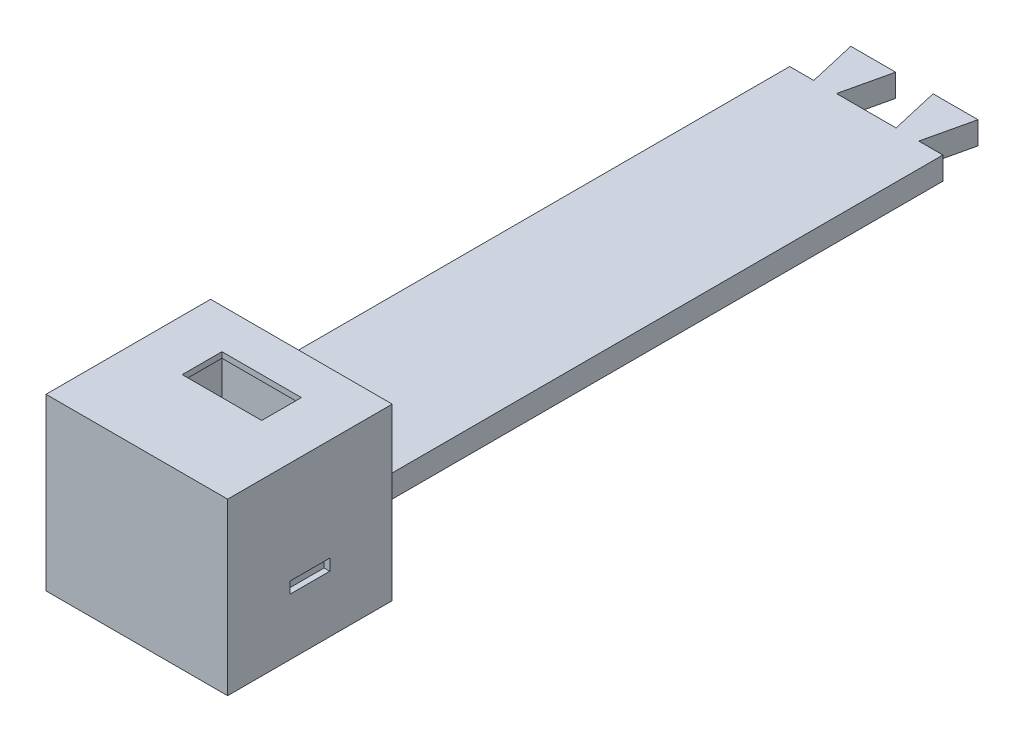
ISO-10303-21;
HEADER;
FILE_DESCRIPTION(('STEP AP214'),'2;1');
FILE_NAME('part.step','',(''),(''),'','','');
FILE_SCHEMA(('AUTOMOTIVE_DESIGN { 1 0 10303 214 1 1 1 1 }'));
ENDSEC;
DATA;
#1=APPLICATION_CONTEXT('core data for automotive mechanical design processes');
#2=APPLICATION_PROTOCOL_DEFINITION('international standard','automotive_design',2000,#1);
#3=PRODUCT_CONTEXT('',#1,'mechanical');
#4=PRODUCT('Part','Part','',(#3));
#5=PRODUCT_RELATED_PRODUCT_CATEGORY('part','',(#4));
#6=PRODUCT_DEFINITION_FORMATION('','',#4);
#7=PRODUCT_DEFINITION_CONTEXT('part definition',#1,'design');
#8=PRODUCT_DEFINITION('design','',#6,#7);
#9=PRODUCT_DEFINITION_SHAPE('','',#8);
#10=(LENGTH_UNIT() NAMED_UNIT(*) SI_UNIT(.MILLI.,.METRE.));
#11=(NAMED_UNIT(*) PLANE_ANGLE_UNIT() SI_UNIT($,.RADIAN.));
#12=(NAMED_UNIT(*) SI_UNIT($,.STERADIAN.) SOLID_ANGLE_UNIT());
#13=UNCERTAINTY_MEASURE_WITH_UNIT(LENGTH_MEASURE(1.E-05),#10,'distance_accuracy_value','');
#14=(GEOMETRIC_REPRESENTATION_CONTEXT(3) GLOBAL_UNCERTAINTY_ASSIGNED_CONTEXT((#13)) GLOBAL_UNIT_ASSIGNED_CONTEXT((#10,
#11,#12)) REPRESENTATION_CONTEXT('',''));
#15=CARTESIAN_POINT('',(0.,0.,0.));
#16=DIRECTION('',(0.,0.,1.));
#17=DIRECTION('',(1.,0.,0.));
#18=AXIS2_PLACEMENT_3D('',#15,#16,#17);
#19=CARTESIAN_POINT('',(0.,0.,0.));
#20=DIRECTION('',(0.,0.,-1.));
#21=DIRECTION('',(-1.,0.,0.));
#22=AXIS2_PLACEMENT_3D('',#19,#20,#21);
#23=PLANE('',#22);
#24=DIRECTION('',(0.,1.,0.));
#25=VECTOR('',#24,1.);
#26=CARTESIAN_POINT('',(3.2929258272084,-2.,0.));
#27=LINE('',#26,#25);
#28=CARTESIAN_POINT('',(3.2929258272084,-2.,0.));
#29=VERTEX_POINT('',#28);
#30=CARTESIAN_POINT('',(3.2929258272084,2.,0.));
#31=VERTEX_POINT('',#30);
#32=EDGE_CURVE('E415',#29,#31,#27,.T.);
#33=ORIENTED_EDGE('',*,*,#32,.T.);
#34=DIRECTION('',(-1.,0.,0.));
#35=VECTOR('',#34,1.);
#36=CARTESIAN_POINT('',(-13.5,2.,0.));
#37=LINE('',#36,#35);
#38=CARTESIAN_POINT('',(11.2070741727916,2.,0.));
#39=VERTEX_POINT('',#38);
#40=EDGE_CURVE('E482',#39,#31,#37,.T.);
#41=ORIENTED_EDGE('',*,*,#40,.F.);
#42=DIRECTION('',(0.,1.,0.));
#43=VECTOR('',#42,1.);
#44=CARTESIAN_POINT('',(11.2070741727916,-2.,0.));
#45=LINE('',#44,#43);
#46=CARTESIAN_POINT('',(11.2070741727916,-2.,0.));
#47=VERTEX_POINT('',#46);
#48=EDGE_CURVE('E438',#47,#39,#45,.T.);
#49=ORIENTED_EDGE('',*,*,#48,.F.);
#50=DIRECTION('',(1.,0.,0.));
#51=VECTOR('',#50,1.);
#52=CARTESIAN_POINT('',(-13.5,-2.,0.));
#53=LINE('',#52,#51);
#54=EDGE_CURVE('E485',#29,#47,#53,.T.);
#55=ORIENTED_EDGE('',*,*,#54,.F.);
#56=EDGE_LOOP('',(#33,#41,#49,#55));
#57=FACE_BOUND('',#56,.T.);
#58=ADVANCED_FACE('F33',(#57),#23,.T.);
#59=CARTESIAN_POINT('',(13.5,-2.,108.));
#60=DIRECTION('',(-1.,0.,0.));
#61=DIRECTION('',(0.,0.,1.));
#62=AXIS2_PLACEMENT_3D('',#59,#60,#61);
#63=PLANE('',#62);
#64=DIRECTION('',(0.,0.,-1.));
#65=VECTOR('',#64,1.);
#66=CARTESIAN_POINT('',(13.5,-2.,108.));
#67=LINE('',#66,#65);
#68=CARTESIAN_POINT('',(13.5,-2.,108.));
#69=VERTEX_POINT('',#68);
#70=CARTESIAN_POINT('',(13.5,-2.,8.47701956363155));
#71=VERTEX_POINT('',#70);
#72=EDGE_CURVE('E481',#69,#71,#67,.T.);
#73=ORIENTED_EDGE('',*,*,#72,.T.);
#74=DIRECTION('',(0.,1.,0.));
#75=VECTOR('',#74,1.);
#76=CARTESIAN_POINT('',(13.5,-2.,8.47701956363155));
#77=LINE('',#76,#75);
#78=CARTESIAN_POINT('',(13.5,2.,8.47701956363155));
#79=VERTEX_POINT('',#78);
#80=EDGE_CURVE('E442',#71,#79,#77,.T.);
#81=ORIENTED_EDGE('',*,*,#80,.T.);
#82=DIRECTION('',(0.,0.,-1.));
#83=VECTOR('',#82,1.);
#84=CARTESIAN_POINT('',(13.5,2.,108.));
#85=LINE('',#84,#83);
#86=CARTESIAN_POINT('',(13.5,2.,108.));
#87=VERTEX_POINT('',#86);
#88=EDGE_CURVE('E11',#87,#79,#85,.T.);
#89=ORIENTED_EDGE('',*,*,#88,.F.);
#90=DIRECTION('',(0.,1.,0.));
#91=VECTOR('',#90,1.);
#92=CARTESIAN_POINT('',(13.5,-2.,108.));
#93=LINE('',#92,#91);
#94=EDGE_CURVE('E468',#69,#87,#93,.T.);
#95=ORIENTED_EDGE('',*,*,#94,.F.);
#96=EDGE_LOOP('',(#73,#81,#89,#95));
#97=FACE_BOUND('',#96,.T.);
#98=ADVANCED_FACE('F35',(#97),#63,.F.);
#99=CARTESIAN_POINT('',(-13.5,2.,108.));
#100=DIRECTION('',(0.,-1.,0.));
#101=DIRECTION('',(0.,0.,-1.));
#102=AXIS2_PLACEMENT_3D('',#99,#100,#101);
#103=PLANE('',#102);
#104=ORIENTED_EDGE('',*,*,#40,.T.);
#105=DIRECTION('',(-0.224951054343862,0.,-0.974370064785236));
#106=VECTOR('',#105,1.);
#107=CARTESIAN_POINT('',(5.25,2.,8.47701956363155));
#108=LINE('',#107,#106);
#109=CARTESIAN_POINT('',(5.25,2.,8.47701956363155));
#110=VERTEX_POINT('',#109);
#111=EDGE_CURVE('E404',#110,#31,#108,.T.);
#112=ORIENTED_EDGE('',*,*,#111,.F.);
#113=DIRECTION('',(1.,0.,0.));
#114=VECTOR('',#113,1.);
#115=CARTESIAN_POINT('',(-5.25,2.,8.47701956363155));
#116=LINE('',#115,#114);
#117=CARTESIAN_POINT('',(-5.25,2.,8.47701956363155));
#118=VERTEX_POINT('',#117);
#119=EDGE_CURVE('E409',#118,#110,#116,.T.);
#120=ORIENTED_EDGE('',*,*,#119,.F.);
#121=DIRECTION('',(-0.224951054343862,0.,0.974370064785236));
#122=VECTOR('',#121,1.);
#123=CARTESIAN_POINT('',(-3.2929258272084,2.,0.));
#124=LINE('',#123,#122);
#125=CARTESIAN_POINT('',(-3.2929258272084,2.,0.));
#126=VERTEX_POINT('',#125);
#127=EDGE_CURVE('E417',#126,#118,#124,.T.);
#128=ORIENTED_EDGE('',*,*,#127,.F.);
#129=CARTESIAN_POINT('',(-11.2070741727916,2.,0.));
#130=VERTEX_POINT('',#129);
#131=EDGE_CURVE('E464',#126,#130,#37,.T.);
#132=ORIENTED_EDGE('',*,*,#131,.T.);
#133=DIRECTION('',(-0.224951054343862,0.,-0.974370064785236));
#134=VECTOR('',#133,1.);
#135=CARTESIAN_POINT('',(-11.2070741727916,2.,0.));
#136=LINE('',#135,#134);
#137=CARTESIAN_POINT('',(-9.25,2.,8.47701956363155));
#138=VERTEX_POINT('',#137);
#139=EDGE_CURVE('E453',#138,#130,#136,.T.);
#140=ORIENTED_EDGE('',*,*,#139,.F.);
#141=DIRECTION('',(1.,0.,0.));
#142=VECTOR('',#141,1.);
#143=CARTESIAN_POINT('',(-9.25,2.,8.47701956363155));
#144=LINE('',#143,#142);
#145=CARTESIAN_POINT('',(-13.5,2.,8.47701956363155));
#146=VERTEX_POINT('',#145);
#147=EDGE_CURVE('E445',#146,#138,#144,.T.);
#148=ORIENTED_EDGE('',*,*,#147,.F.);
#149=DIRECTION('',(0.,0.,-1.));
#150=VECTOR('',#149,1.);
#151=CARTESIAN_POINT('',(-13.5,2.,108.));
#152=LINE('',#151,#150);
#153=CARTESIAN_POINT('',(-13.5,2.,108.));
#154=VERTEX_POINT('',#153);
#155=EDGE_CURVE('E41',#154,#146,#152,.T.);
#156=ORIENTED_EDGE('',*,*,#155,.F.);
#157=DIRECTION('',(-1.,0.,0.));
#158=VECTOR('',#157,1.);
#159=CARTESIAN_POINT('',(-13.5,2.,108.));
#160=LINE('',#159,#158);
#161=EDGE_CURVE('E471',#87,#154,#160,.T.);
#162=ORIENTED_EDGE('',*,*,#161,.F.);
#163=ORIENTED_EDGE('',*,*,#88,.T.);
#164=DIRECTION('',(1.,0.,0.));
#165=VECTOR('',#164,1.);
#166=CARTESIAN_POINT('',(9.25,2.,8.47701956363155));
#167=LINE('',#166,#165);
#168=CARTESIAN_POINT('',(9.25,2.,8.47701956363155));
#169=VERTEX_POINT('',#168);
#170=EDGE_CURVE('E435',#169,#79,#167,.T.);
#171=ORIENTED_EDGE('',*,*,#170,.F.);
#172=DIRECTION('',(-0.224951054343858,0.,0.974370064785237));
#173=VECTOR('',#172,1.);
#174=CARTESIAN_POINT('',(11.2070741727916,2.,0.));
#175=LINE('',#174,#173);
#176=EDGE_CURVE('E424',#39,#169,#175,.T.);
#177=ORIENTED_EDGE('',*,*,#176,.F.);
#178=EDGE_LOOP('',(#104,#112,#120,#128,#132,#140,#148,#156,#162,#163,#171,#177));
#179=FACE_BOUND('',#178,.T.);
#180=ADVANCED_FACE('F499',(#179),#103,.F.);
#181=CARTESIAN_POINT('',(-13.5,-2.,108.));
#182=DIRECTION('',(1.,0.,0.));
#183=DIRECTION('',(0.,0.,-1.));
#184=AXIS2_PLACEMENT_3D('',#181,#182,#183);
#185=PLANE('',#184);
#186=ORIENTED_EDGE('',*,*,#155,.T.);
#187=DIRECTION('',(0.,1.,0.));
#188=VECTOR('',#187,1.);
#189=CARTESIAN_POINT('',(-13.5,-2.,8.47701956363155));
#190=LINE('',#189,#188);
#191=CARTESIAN_POINT('',(-13.5,-2.,8.47701956363155));
#192=VERTEX_POINT('',#191);
#193=EDGE_CURVE('E456',#192,#146,#190,.T.);
#194=ORIENTED_EDGE('',*,*,#193,.F.);
#195=DIRECTION('',(0.,0.,-1.));
#196=VECTOR('',#195,1.);
#197=CARTESIAN_POINT('',(-13.5,-2.,108.));
#198=LINE('',#197,#196);
#199=CARTESIAN_POINT('',(-13.5,-2.,108.));
#200=VERTEX_POINT('',#199);
#201=EDGE_CURVE('E490',#200,#192,#198,.T.);
#202=ORIENTED_EDGE('',*,*,#201,.F.);
#203=DIRECTION('',(0.,-1.,0.));
#204=VECTOR('',#203,1.);
#205=CARTESIAN_POINT('',(-13.5,-2.,108.));
#206=LINE('',#205,#204);
#207=EDGE_CURVE('E475',#154,#200,#206,.T.);
#208=ORIENTED_EDGE('',*,*,#207,.F.);
#209=EDGE_LOOP('',(#186,#194,#202,#208));
#210=FACE_BOUND('',#209,.T.);
#211=ADVANCED_FACE('F496',(#210),#185,.F.);
#212=CARTESIAN_POINT('',(-13.5,-2.,108.));
#213=DIRECTION('',(0.,1.,0.));
#214=DIRECTION('',(0.,0.,1.));
#215=AXIS2_PLACEMENT_3D('',#212,#213,#214);
#216=PLANE('',#215);
#217=DIRECTION('',(1.,0.,0.));
#218=VECTOR('',#217,1.);
#219=CARTESIAN_POINT('',(-5.25,-2.,8.47701956363155));
#220=LINE('',#219,#218);
#221=CARTESIAN_POINT('',(-5.25,-2.,8.47701956363155));
#222=VERTEX_POINT('',#221);
#223=CARTESIAN_POINT('',(5.25,-2.,8.47701956363155));
#224=VERTEX_POINT('',#223);
#225=EDGE_CURVE('E412',#222,#224,#220,.T.);
#226=ORIENTED_EDGE('',*,*,#225,.T.);
#227=DIRECTION('',(-0.224951054343862,0.,-0.974370064785236));
#228=VECTOR('',#227,1.);
#229=CARTESIAN_POINT('',(5.25,-2.,8.47701956363155));
#230=LINE('',#229,#228);
#231=EDGE_CURVE('E405',#224,#29,#230,.T.);
#232=ORIENTED_EDGE('',*,*,#231,.T.);
#233=ORIENTED_EDGE('',*,*,#54,.T.);
#234=DIRECTION('',(-0.224951054343858,0.,0.974370064785237));
#235=VECTOR('',#234,1.);
#236=CARTESIAN_POINT('',(11.2070741727916,-2.,0.));
#237=LINE('',#236,#235);
#238=CARTESIAN_POINT('',(9.25,-2.,8.47701956363155));
#239=VERTEX_POINT('',#238);
#240=EDGE_CURVE('E431',#47,#239,#237,.T.);
#241=ORIENTED_EDGE('',*,*,#240,.T.);
#242=DIRECTION('',(1.,0.,0.));
#243=VECTOR('',#242,1.);
#244=CARTESIAN_POINT('',(9.25,-2.,8.47701956363155));
#245=LINE('',#244,#243);
#246=EDGE_CURVE('E434',#239,#71,#245,.T.);
#247=ORIENTED_EDGE('',*,*,#246,.T.);
#248=ORIENTED_EDGE('',*,*,#72,.F.);
#249=DIRECTION('',(1.,0.,0.));
#250=VECTOR('',#249,1.);
#251=CARTESIAN_POINT('',(-13.5,-2.,108.));
#252=LINE('',#251,#250);
#253=EDGE_CURVE('E478',#200,#69,#252,.T.);
#254=ORIENTED_EDGE('',*,*,#253,.F.);
#255=ORIENTED_EDGE('',*,*,#201,.T.);
#256=DIRECTION('',(1.,0.,0.));
#257=VECTOR('',#256,1.);
#258=CARTESIAN_POINT('',(-9.25,-2.,8.47701956363155));
#259=LINE('',#258,#257);
#260=CARTESIAN_POINT('',(-9.25,-2.,8.47701956363155));
#261=VERTEX_POINT('',#260);
#262=EDGE_CURVE('E449',#192,#261,#259,.T.);
#263=ORIENTED_EDGE('',*,*,#262,.T.);
#264=DIRECTION('',(-0.224951054343862,0.,-0.974370064785236));
#265=VECTOR('',#264,1.);
#266=CARTESIAN_POINT('',(-11.2070741727916,-2.,0.));
#267=LINE('',#266,#265);
#268=CARTESIAN_POINT('',(-11.2070741727916,-2.,0.));
#269=VERTEX_POINT('',#268);
#270=EDGE_CURVE('E452',#261,#269,#267,.T.);
#271=ORIENTED_EDGE('',*,*,#270,.T.);
#272=CARTESIAN_POINT('',(-3.2929258272084,-2.,0.));
#273=VERTEX_POINT('',#272);
#274=EDGE_CURVE('E472',#269,#273,#53,.T.);
#275=ORIENTED_EDGE('',*,*,#274,.T.);
#276=DIRECTION('',(-0.224951054343862,0.,0.974370064785236));
#277=VECTOR('',#276,1.);
#278=CARTESIAN_POINT('',(-3.2929258272084,-2.,0.));
#279=LINE('',#278,#277);
#280=EDGE_CURVE('E408',#273,#222,#279,.T.);
#281=ORIENTED_EDGE('',*,*,#280,.T.);
#282=EDGE_LOOP('',(#226,#232,#233,#241,#247,#248,#254,#255,#263,#271,#275,#281));
#283=FACE_BOUND('',#282,.T.);
#284=ADVANCED_FACE('F506',(#283),#216,.F.);
#285=DIRECTION('',(0.,1.,0.));
#286=VECTOR('',#285,1.);
#287=CARTESIAN_POINT('',(-3.2929258272084,-2.,0.));
#288=LINE('',#287,#286);
#289=EDGE_CURVE('E427',#273,#126,#288,.T.);
#290=ORIENTED_EDGE('',*,*,#289,.F.);
#291=ORIENTED_EDGE('',*,*,#274,.F.);
#292=DIRECTION('',(0.,1.,0.));
#293=VECTOR('',#292,1.);
#294=CARTESIAN_POINT('',(-11.2070741727916,-2.,0.));
#295=LINE('',#294,#293);
#296=EDGE_CURVE('E461',#269,#130,#295,.T.);
#297=ORIENTED_EDGE('',*,*,#296,.T.);
#298=ORIENTED_EDGE('',*,*,#131,.F.);
#299=EDGE_LOOP('',(#290,#291,#297,#298));
#300=FACE_BOUND('',#299,.T.);
#301=ADVANCED_FACE('F539',(#300),#23,.T.);
#302=CARTESIAN_POINT('',(-11.2070741727916,-2.,0.));
#303=DIRECTION('',(0.974370064785236,0.,-0.224951054343862));
#304=DIRECTION('',(-0.224951054343862,0.,-0.974370064785236));
#305=AXIS2_PLACEMENT_3D('',#302,#303,#304);
#306=PLANE('',#305);
#307=ORIENTED_EDGE('',*,*,#139,.T.);
#308=ORIENTED_EDGE('',*,*,#296,.F.);
#309=ORIENTED_EDGE('',*,*,#270,.F.);
#310=DIRECTION('',(0.,1.,0.));
#311=VECTOR('',#310,1.);
#312=CARTESIAN_POINT('',(-9.25,-2.,8.47701956363155));
#313=LINE('',#312,#311);
#314=EDGE_CURVE('E465',#261,#138,#313,.T.);
#315=ORIENTED_EDGE('',*,*,#314,.T.);
#316=EDGE_LOOP('',(#307,#308,#309,#315));
#317=FACE_BOUND('',#316,.T.);
#318=ADVANCED_FACE('F541',(#317),#306,.F.);
#319=CARTESIAN_POINT('',(-9.25,-2.,8.47701956363155));
#320=DIRECTION('',(0.,0.,1.));
#321=DIRECTION('',(1.,0.,0.));
#322=AXIS2_PLACEMENT_3D('',#319,#320,#321);
#323=PLANE('',#322);
#324=ORIENTED_EDGE('',*,*,#147,.T.);
#325=ORIENTED_EDGE('',*,*,#314,.F.);
#326=ORIENTED_EDGE('',*,*,#262,.F.);
#327=ORIENTED_EDGE('',*,*,#193,.T.);
#328=EDGE_LOOP('',(#324,#325,#326,#327));
#329=FACE_BOUND('',#328,.T.);
#330=ADVANCED_FACE('F503',(#329),#323,.F.);
#331=CARTESIAN_POINT('',(9.25,-2.,8.47701956363155));
#332=DIRECTION('',(0.,0.,1.));
#333=DIRECTION('',(1.,0.,0.));
#334=AXIS2_PLACEMENT_3D('',#331,#332,#333);
#335=PLANE('',#334);
#336=ORIENTED_EDGE('',*,*,#170,.T.);
#337=ORIENTED_EDGE('',*,*,#80,.F.);
#338=ORIENTED_EDGE('',*,*,#246,.F.);
#339=DIRECTION('',(0.,1.,0.));
#340=VECTOR('',#339,1.);
#341=CARTESIAN_POINT('',(9.25,-2.,8.47701956363155));
#342=LINE('',#341,#340);
#343=EDGE_CURVE('E446',#239,#169,#342,.T.);
#344=ORIENTED_EDGE('',*,*,#343,.T.);
#345=EDGE_LOOP('',(#336,#337,#338,#344));
#346=FACE_BOUND('',#345,.T.);
#347=ADVANCED_FACE('F517',(#346),#335,.F.);
#348=CARTESIAN_POINT('',(11.2070741727916,-2.,0.));
#349=DIRECTION('',(-0.974370064785237,0.,-0.224951054343858));
#350=DIRECTION('',(-0.224951054343858,0.,0.974370064785237));
#351=AXIS2_PLACEMENT_3D('',#348,#349,#350);
#352=PLANE('',#351);
#353=ORIENTED_EDGE('',*,*,#176,.T.);
#354=ORIENTED_EDGE('',*,*,#343,.F.);
#355=ORIENTED_EDGE('',*,*,#240,.F.);
#356=ORIENTED_EDGE('',*,*,#48,.T.);
#357=EDGE_LOOP('',(#353,#354,#355,#356));
#358=FACE_BOUND('',#357,.T.);
#359=ADVANCED_FACE('F521',(#358),#352,.F.);
#360=CARTESIAN_POINT('',(5.25,-2.,8.47701956363155));
#361=DIRECTION('',(0.974370064785236,0.,-0.224951054343862));
#362=DIRECTION('',(-0.224951054343862,0.,-0.974370064785236));
#363=AXIS2_PLACEMENT_3D('',#360,#361,#362);
#364=PLANE('',#363);
#365=ORIENTED_EDGE('',*,*,#111,.T.);
#366=ORIENTED_EDGE('',*,*,#32,.F.);
#367=ORIENTED_EDGE('',*,*,#231,.F.);
#368=DIRECTION('',(0.,1.,0.));
#369=VECTOR('',#368,1.);
#370=CARTESIAN_POINT('',(5.25,-2.,8.47701956363155));
#371=LINE('',#370,#369);
#372=EDGE_CURVE('E422',#224,#110,#371,.T.);
#373=ORIENTED_EDGE('',*,*,#372,.T.);
#374=EDGE_LOOP('',(#365,#366,#367,#373));
#375=FACE_BOUND('',#374,.T.);
#376=ADVANCED_FACE('F529',(#375),#364,.F.);
#377=CARTESIAN_POINT('',(-5.25,-2.,8.47701956363155));
#378=DIRECTION('',(0.,0.,1.));
#379=DIRECTION('',(1.,0.,0.));
#380=AXIS2_PLACEMENT_3D('',#377,#378,#379);
#381=PLANE('',#380);
#382=ORIENTED_EDGE('',*,*,#119,.T.);
#383=ORIENTED_EDGE('',*,*,#372,.F.);
#384=ORIENTED_EDGE('',*,*,#225,.F.);
#385=DIRECTION('',(0.,1.,0.));
#386=VECTOR('',#385,1.);
#387=CARTESIAN_POINT('',(-5.25,-2.,8.47701956363155));
#388=LINE('',#387,#386);
#389=EDGE_CURVE('E425',#222,#118,#388,.T.);
#390=ORIENTED_EDGE('',*,*,#389,.T.);
#391=EDGE_LOOP('',(#382,#383,#384,#390));
#392=FACE_BOUND('',#391,.T.);
#393=ADVANCED_FACE('F533',(#392),#381,.F.);
#394=CARTESIAN_POINT('',(-3.2929258272084,-2.,0.));
#395=DIRECTION('',(-0.974370064785236,0.,-0.224951054343863));
#396=DIRECTION('',(-0.224951054343863,0.,0.974370064785236));
#397=AXIS2_PLACEMENT_3D('',#394,#395,#396);
#398=PLANE('',#397);
#399=ORIENTED_EDGE('',*,*,#127,.T.);
#400=ORIENTED_EDGE('',*,*,#389,.F.);
#401=ORIENTED_EDGE('',*,*,#280,.F.);
#402=ORIENTED_EDGE('',*,*,#289,.T.);
#403=EDGE_LOOP('',(#399,#400,#401,#402));
#404=FACE_BOUND('',#403,.T.);
#405=ADVANCED_FACE('F535',(#404),#398,.F.);
#406=CARTESIAN_POINT('',(0.,0.,108.));
#407=DIRECTION('',(0.,0.,-1.));
#408=DIRECTION('',(-1.,0.,0.));
#409=AXIS2_PLACEMENT_3D('',#406,#407,#408);
#410=PLANE('',#409);
#411=DIRECTION('',(0.,1.,0.));
#412=VECTOR('',#411,1.);
#413=CARTESIAN_POINT('',(16.,-15.,108.));
#414=LINE('',#413,#412);
#415=CARTESIAN_POINT('',(16.,-15.,108.));
#416=VERTEX_POINT('',#415);
#417=CARTESIAN_POINT('',(16.,15.,108.));
#418=VERTEX_POINT('',#417);
#419=EDGE_CURVE('E368',#416,#418,#414,.T.);
#420=ORIENTED_EDGE('',*,*,#419,.F.);
#421=DIRECTION('',(1.,0.,0.));
#422=VECTOR('',#421,1.);
#423=CARTESIAN_POINT('',(-16.,-15.,108.));
#424=LINE('',#423,#422);
#425=CARTESIAN_POINT('',(-16.,-15.,108.));
#426=VERTEX_POINT('',#425);
#427=EDGE_CURVE('E379',#426,#416,#424,.T.);
#428=ORIENTED_EDGE('',*,*,#427,.F.);
#429=DIRECTION('',(0.,-1.,0.));
#430=VECTOR('',#429,1.);
#431=CARTESIAN_POINT('',(-16.,-15.,108.));
#432=LINE('',#431,#430);
#433=CARTESIAN_POINT('',(-16.,15.,108.));
#434=VERTEX_POINT('',#433);
#435=EDGE_CURVE('E390',#434,#426,#432,.T.);
#436=ORIENTED_EDGE('',*,*,#435,.F.);
#437=DIRECTION('',(-1.,0.,0.));
#438=VECTOR('',#437,1.);
#439=CARTESIAN_POINT('',(-16.,15.,108.));
#440=LINE('',#439,#438);
#441=EDGE_CURVE('E388',#418,#434,#440,.T.);
#442=ORIENTED_EDGE('',*,*,#441,.F.);
#443=EDGE_LOOP('',(#420,#428,#436,#442));
#444=FACE_BOUND('',#443,.T.);
#445=ORIENTED_EDGE('',*,*,#94,.T.);
#446=ORIENTED_EDGE('',*,*,#161,.T.);
#447=ORIENTED_EDGE('',*,*,#207,.T.);
#448=ORIENTED_EDGE('',*,*,#253,.T.);
#449=EDGE_LOOP('',(#445,#446,#447,#448));
#450=FACE_BOUND('',#449,.T.);
#451=ADVANCED_FACE('F511',(#444,#450),#410,.T.);
#452=CARTESIAN_POINT('',(16.,-15.,137.));
#453=DIRECTION('',(-1.,0.,0.));
#454=DIRECTION('',(0.,0.,1.));
#455=AXIS2_PLACEMENT_3D('',#452,#453,#454);
#456=PLANE('',#455);
#457=DIRECTION('',(0.,0.,-1.));
#458=VECTOR('',#457,1.);
#459=CARTESIAN_POINT('',(16.,-5.,126.));
#460=LINE('',#459,#458);
#461=CARTESIAN_POINT('',(16.,-5.,126.));
#462=VERTEX_POINT('',#461);
#463=CARTESIAN_POINT('',(16.,-5.,119.));
#464=VERTEX_POINT('',#463);
#465=EDGE_CURVE('E326',#462,#464,#460,.T.);
#466=ORIENTED_EDGE('',*,*,#465,.F.);
#467=DIRECTION('',(0.,-1.,0.));
#468=VECTOR('',#467,1.);
#469=CARTESIAN_POINT('',(16.,-5.,126.));
#470=LINE('',#469,#468);
#471=CARTESIAN_POINT('',(16.,-3.,126.));
#472=VERTEX_POINT('',#471);
#473=EDGE_CURVE('E304',#472,#462,#470,.T.);
#474=ORIENTED_EDGE('',*,*,#473,.F.);
#475=DIRECTION('',(0.,0.,1.));
#476=VECTOR('',#475,1.);
#477=CARTESIAN_POINT('',(16.,-3.,126.));
#478=LINE('',#477,#476);
#479=CARTESIAN_POINT('',(16.,-3.,119.));
#480=VERTEX_POINT('',#479);
#481=EDGE_CURVE('E315',#480,#472,#478,.T.);
#482=ORIENTED_EDGE('',*,*,#481,.F.);
#483=DIRECTION('',(0.,1.,0.));
#484=VECTOR('',#483,1.);
#485=CARTESIAN_POINT('',(16.,-3.,119.));
#486=LINE('',#485,#484);
#487=EDGE_CURVE('E329',#464,#480,#486,.T.);
#488=ORIENTED_EDGE('',*,*,#487,.F.);
#489=EDGE_LOOP('',(#466,#474,#482,#488));
#490=FACE_BOUND('',#489,.T.);
#491=ORIENTED_EDGE('',*,*,#419,.T.);
#492=DIRECTION('',(0.,0.,-1.));
#493=VECTOR('',#492,1.);
#494=CARTESIAN_POINT('',(16.,15.,137.));
#495=LINE('',#494,#493);
#496=CARTESIAN_POINT('',(16.,15.,137.));
#497=VERTEX_POINT('',#496);
#498=EDGE_CURVE('E401',#497,#418,#495,.T.);
#499=ORIENTED_EDGE('',*,*,#498,.F.);
#500=DIRECTION('',(0.,1.,0.));
#501=VECTOR('',#500,1.);
#502=CARTESIAN_POINT('',(16.,-15.,137.));
#503=LINE('',#502,#501);
#504=CARTESIAN_POINT('',(16.,-15.,137.));
#505=VERTEX_POINT('',#504);
#506=EDGE_CURVE('E375',#505,#497,#503,.T.);
#507=ORIENTED_EDGE('',*,*,#506,.F.);
#508=DIRECTION('',(0.,0.,-1.));
#509=VECTOR('',#508,1.);
#510=CARTESIAN_POINT('',(16.,-15.,137.));
#511=LINE('',#510,#509);
#512=EDGE_CURVE('E385',#505,#416,#511,.T.);
#513=ORIENTED_EDGE('',*,*,#512,.T.);
#514=EDGE_LOOP('',(#491,#499,#507,#513));
#515=FACE_BOUND('',#514,.T.);
#516=ADVANCED_FACE('F646',(#490,#515),#456,.F.);
#517=CARTESIAN_POINT('',(-16.,15.,137.));
#518=DIRECTION('',(0.,-1.,0.));
#519=DIRECTION('',(0.,0.,-1.));
#520=AXIS2_PLACEMENT_3D('',#517,#518,#519);
#521=PLANE('',#520);
#522=DIRECTION('',(0.,0.,1.));
#523=VECTOR('',#522,1.);
#524=CARTESIAN_POINT('',(7.00000000000001,15.,122.));
#525=LINE('',#524,#523);
#526=CARTESIAN_POINT('',(7.00000000000002,15.,115.));
#527=VERTEX_POINT('',#526);
#528=CARTESIAN_POINT('',(7.00000000000001,15.,122.));
#529=VERTEX_POINT('',#528);
#530=EDGE_CURVE('E250',#527,#529,#525,.T.);
#531=ORIENTED_EDGE('',*,*,#530,.T.);
#532=DIRECTION('',(-1.,0.,0.));
#533=VECTOR('',#532,1.);
#534=CARTESIAN_POINT('',(-6.99999999999998,15.,122.));
#535=LINE('',#534,#533);
#536=CARTESIAN_POINT('',(-6.99999999999998,15.,122.));
#537=VERTEX_POINT('',#536);
#538=EDGE_CURVE('E244',#529,#537,#535,.T.);
#539=ORIENTED_EDGE('',*,*,#538,.T.);
#540=DIRECTION('',(0.,0.,-1.));
#541=VECTOR('',#540,1.);
#542=CARTESIAN_POINT('',(-6.99999999999998,15.,115.));
#543=LINE('',#542,#541);
#544=CARTESIAN_POINT('',(-6.99999999999998,15.,115.));
#545=VERTEX_POINT('',#544);
#546=EDGE_CURVE('E253',#537,#545,#543,.T.);
#547=ORIENTED_EDGE('',*,*,#546,.T.);
#548=DIRECTION('',(1.,0.,0.));
#549=VECTOR('',#548,1.);
#550=CARTESIAN_POINT('',(7.00000000000002,15.,115.));
#551=LINE('',#550,#549);
#552=EDGE_CURVE('E48',#545,#527,#551,.T.);
#553=ORIENTED_EDGE('',*,*,#552,.T.);
#554=EDGE_LOOP('',(#531,#539,#547,#553));
#555=FACE_BOUND('',#554,.T.);
#556=ORIENTED_EDGE('',*,*,#441,.T.);
#557=DIRECTION('',(0.,0.,-1.));
#558=VECTOR('',#557,1.);
#559=CARTESIAN_POINT('',(-16.,15.,137.));
#560=LINE('',#559,#558);
#561=CARTESIAN_POINT('',(-16.,15.,137.));
#562=VERTEX_POINT('',#561);
#563=EDGE_CURVE('E398',#562,#434,#560,.T.);
#564=ORIENTED_EDGE('',*,*,#563,.F.);
#565=DIRECTION('',(-1.,0.,0.));
#566=VECTOR('',#565,1.);
#567=CARTESIAN_POINT('',(-16.,15.,137.));
#568=LINE('',#567,#566);
#569=EDGE_CURVE('E378',#497,#562,#568,.T.);
#570=ORIENTED_EDGE('',*,*,#569,.F.);
#571=ORIENTED_EDGE('',*,*,#498,.T.);
#572=EDGE_LOOP('',(#556,#564,#570,#571));
#573=FACE_BOUND('',#572,.T.);
#574=ADVANCED_FACE('F257',(#555,#573),#521,.F.);
#575=CARTESIAN_POINT('',(-16.,-15.,137.));
#576=DIRECTION('',(1.,0.,0.));
#577=DIRECTION('',(0.,0.,-1.));
#578=AXIS2_PLACEMENT_3D('',#575,#576,#577);
#579=PLANE('',#578);
#580=DIRECTION('',(0.,-1.,0.));
#581=VECTOR('',#580,1.);
#582=CARTESIAN_POINT('',(-16.,-5.00000000000001,119.));
#583=LINE('',#582,#581);
#584=CARTESIAN_POINT('',(-16.,-3.,119.));
#585=VERTEX_POINT('',#584);
#586=CARTESIAN_POINT('',(-16.,-5.00000000000001,119.));
#587=VERTEX_POINT('',#586);
#588=EDGE_CURVE('E294',#585,#587,#583,.T.);
#589=ORIENTED_EDGE('',*,*,#588,.F.);
#590=DIRECTION('',(0.,0.,-1.));
#591=VECTOR('',#590,1.);
#592=CARTESIAN_POINT('',(-16.,-3.00000000000001,119.));
#593=LINE('',#592,#591);
#594=CARTESIAN_POINT('',(-16.,-3.00000000000001,126.));
#595=VERTEX_POINT('',#594);
#596=EDGE_CURVE('E275',#595,#585,#593,.T.);
#597=ORIENTED_EDGE('',*,*,#596,.F.);
#598=DIRECTION('',(0.,1.,0.));
#599=VECTOR('',#598,1.);
#600=CARTESIAN_POINT('',(-16.,-3.00000000000001,126.));
#601=LINE('',#600,#599);
#602=CARTESIAN_POINT('',(-16.,-5.,126.));
#603=VERTEX_POINT('',#602);
#604=EDGE_CURVE('E283',#603,#595,#601,.T.);
#605=ORIENTED_EDGE('',*,*,#604,.F.);
#606=DIRECTION('',(0.,0.,1.));
#607=VECTOR('',#606,1.);
#608=CARTESIAN_POINT('',(-16.,-5.,126.));
#609=LINE('',#608,#607);
#610=EDGE_CURVE('E297',#587,#603,#609,.T.);
#611=ORIENTED_EDGE('',*,*,#610,.F.);
#612=EDGE_LOOP('',(#589,#597,#605,#611));
#613=FACE_BOUND('',#612,.T.);
#614=ORIENTED_EDGE('',*,*,#435,.T.);
#615=DIRECTION('',(0.,0.,-1.));
#616=VECTOR('',#615,1.);
#617=CARTESIAN_POINT('',(-16.,-15.,137.));
#618=LINE('',#617,#616);
#619=CARTESIAN_POINT('',(-16.,-15.,137.));
#620=VERTEX_POINT('',#619);
#621=EDGE_CURVE('E395',#620,#426,#618,.T.);
#622=ORIENTED_EDGE('',*,*,#621,.F.);
#623=DIRECTION('',(0.,-1.,0.));
#624=VECTOR('',#623,1.);
#625=CARTESIAN_POINT('',(-16.,-15.,137.));
#626=LINE('',#625,#624);
#627=EDGE_CURVE('E381',#562,#620,#626,.T.);
#628=ORIENTED_EDGE('',*,*,#627,.F.);
#629=ORIENTED_EDGE('',*,*,#563,.T.);
#630=EDGE_LOOP('',(#614,#622,#628,#629));
#631=FACE_BOUND('',#630,.T.);
#632=ADVANCED_FACE('F663',(#613,#631),#579,.F.);
#633=CARTESIAN_POINT('',(-16.,-15.,137.));
#634=DIRECTION('',(0.,1.,0.));
#635=DIRECTION('',(0.,0.,1.));
#636=AXIS2_PLACEMENT_3D('',#633,#634,#635);
#637=PLANE('',#636);
#638=DIRECTION('',(-1.,0.,0.));
#639=VECTOR('',#638,1.);
#640=CARTESIAN_POINT('',(-13.5,-15.,136.5));
#641=LINE('',#640,#639);
#642=CARTESIAN_POINT('',(13.5,-15.,136.5));
#643=VERTEX_POINT('',#642);
#644=CARTESIAN_POINT('',(-13.5,-15.,136.5));
#645=VERTEX_POINT('',#644);
#646=EDGE_CURVE('E358',#643,#645,#641,.T.);
#647=ORIENTED_EDGE('',*,*,#646,.F.);
#648=DIRECTION('',(0.,0.,1.));
#649=VECTOR('',#648,1.);
#650=CARTESIAN_POINT('',(13.5,-15.,108.5));
#651=LINE('',#650,#649);
#652=CARTESIAN_POINT('',(13.5,-15.,108.5));
#653=VERTEX_POINT('',#652);
#654=EDGE_CURVE('E336',#653,#643,#651,.T.);
#655=ORIENTED_EDGE('',*,*,#654,.F.);
#656=DIRECTION('',(1.,0.,0.));
#657=VECTOR('',#656,1.);
#658=CARTESIAN_POINT('',(-13.5,-15.,108.5));
#659=LINE('',#658,#657);
#660=CARTESIAN_POINT('',(-13.5,-15.,108.5));
#661=VERTEX_POINT('',#660);
#662=EDGE_CURVE('E347',#661,#653,#659,.T.);
#663=ORIENTED_EDGE('',*,*,#662,.F.);
#664=DIRECTION('',(0.,0.,-1.));
#665=VECTOR('',#664,1.);
#666=CARTESIAN_POINT('',(-13.5,-15.,108.5));
#667=LINE('',#666,#665);
#668=EDGE_CURVE('E361',#645,#661,#667,.T.);
#669=ORIENTED_EDGE('',*,*,#668,.F.);
#670=EDGE_LOOP('',(#647,#655,#663,#669));
#671=FACE_BOUND('',#670,.T.);
#672=ORIENTED_EDGE('',*,*,#427,.T.);
#673=ORIENTED_EDGE('',*,*,#512,.F.);
#674=DIRECTION('',(1.,0.,0.));
#675=VECTOR('',#674,1.);
#676=CARTESIAN_POINT('',(-16.,-15.,137.));
#677=LINE('',#676,#675);
#678=EDGE_CURVE('E383',#620,#505,#677,.T.);
#679=ORIENTED_EDGE('',*,*,#678,.F.);
#680=ORIENTED_EDGE('',*,*,#621,.T.);
#681=EDGE_LOOP('',(#672,#673,#679,#680));
#682=FACE_BOUND('',#681,.T.);
#683=ADVANCED_FACE('F672',(#671,#682),#637,.F.);
#684=CARTESIAN_POINT('',(0.,0.,137.));
#685=DIRECTION('',(0.,0.,-1.));
#686=DIRECTION('',(-1.,0.,0.));
#687=AXIS2_PLACEMENT_3D('',#684,#685,#686);
#688=PLANE('',#687);
#689=ORIENTED_EDGE('',*,*,#506,.T.);
#690=ORIENTED_EDGE('',*,*,#569,.T.);
#691=ORIENTED_EDGE('',*,*,#627,.T.);
#692=ORIENTED_EDGE('',*,*,#678,.T.);
#693=EDGE_LOOP('',(#689,#690,#691,#692));
#694=FACE_BOUND('',#693,.T.);
#695=ADVANCED_FACE('F682',(#694),#688,.F.);
#696=CARTESIAN_POINT('',(13.5,14.,108.5));
#697=DIRECTION('',(1.,0.,0.));
#698=DIRECTION('',(0.,0.,-1.));
#699=AXIS2_PLACEMENT_3D('',#696,#697,#698);
#700=PLANE('',#699);
#701=ORIENTED_EDGE('',*,*,#654,.T.);
#702=DIRECTION('',(0.,-1.,0.));
#703=VECTOR('',#702,1.);
#704=CARTESIAN_POINT('',(13.5,14.,136.5));
#705=LINE('',#704,#703);
#706=CARTESIAN_POINT('',(13.5,14.,136.5));
#707=VERTEX_POINT('',#706);
#708=EDGE_CURVE('E356',#707,#643,#705,.T.);
#709=ORIENTED_EDGE('',*,*,#708,.F.);
#710=DIRECTION('',(0.,0.,1.));
#711=VECTOR('',#710,1.);
#712=CARTESIAN_POINT('',(13.5,14.,108.5));
#713=LINE('',#712,#711);
#714=CARTESIAN_POINT('',(13.5,14.,108.5));
#715=VERTEX_POINT('',#714);
#716=EDGE_CURVE('E343',#715,#707,#713,.T.);
#717=ORIENTED_EDGE('',*,*,#716,.F.);
#718=DIRECTION('',(0.,-1.,0.));
#719=VECTOR('',#718,1.);
#720=CARTESIAN_POINT('',(13.5,14.,108.5));
#721=LINE('',#720,#719);
#722=EDGE_CURVE('E366',#715,#653,#721,.T.);
#723=ORIENTED_EDGE('',*,*,#722,.T.);
#724=EDGE_LOOP('',(#701,#709,#717,#723));
#725=FACE_BOUND('',#724,.T.);
#726=ADVANCED_FACE('F690',(#725),#700,.F.);
#727=CARTESIAN_POINT('',(-13.5,14.,108.5));
#728=DIRECTION('',(0.,0.,-1.));
#729=DIRECTION('',(-1.,0.,0.));
#730=AXIS2_PLACEMENT_3D('',#727,#728,#729);
#731=PLANE('',#730);
#732=ORIENTED_EDGE('',*,*,#662,.T.);
#733=ORIENTED_EDGE('',*,*,#722,.F.);
#734=DIRECTION('',(1.,0.,0.));
#735=VECTOR('',#734,1.);
#736=CARTESIAN_POINT('',(-13.5,14.,108.5));
#737=LINE('',#736,#735);
#738=CARTESIAN_POINT('',(-13.5,14.,108.5));
#739=VERTEX_POINT('',#738);
#740=EDGE_CURVE('E353',#739,#715,#737,.T.);
#741=ORIENTED_EDGE('',*,*,#740,.F.);
#742=DIRECTION('',(0.,-1.,0.));
#743=VECTOR('',#742,1.);
#744=CARTESIAN_POINT('',(-13.5,14.,108.5));
#745=LINE('',#744,#743);
#746=EDGE_CURVE('E369',#739,#661,#745,.T.);
#747=ORIENTED_EDGE('',*,*,#746,.T.);
#748=EDGE_LOOP('',(#732,#733,#741,#747));
#749=FACE_BOUND('',#748,.T.);
#750=ADVANCED_FACE('F697',(#749),#731,.F.);
#751=CARTESIAN_POINT('',(-13.5,14.,108.5));
#752=DIRECTION('',(-1.,0.,0.));
#753=DIRECTION('',(0.,0.,1.));
#754=AXIS2_PLACEMENT_3D('',#751,#752,#753);
#755=PLANE('',#754);
#756=ORIENTED_EDGE('',*,*,#668,.T.);
#757=ORIENTED_EDGE('',*,*,#746,.F.);
#758=DIRECTION('',(0.,0.,-1.));
#759=VECTOR('',#758,1.);
#760=CARTESIAN_POINT('',(-13.5,14.,108.5));
#761=LINE('',#760,#759);
#762=CARTESIAN_POINT('',(-13.5,14.,136.5));
#763=VERTEX_POINT('',#762);
#764=EDGE_CURVE('E350',#763,#739,#761,.T.);
#765=ORIENTED_EDGE('',*,*,#764,.F.);
#766=DIRECTION('',(0.,-1.,0.));
#767=VECTOR('',#766,1.);
#768=CARTESIAN_POINT('',(-13.5,14.,136.5));
#769=LINE('',#768,#767);
#770=EDGE_CURVE('E371',#763,#645,#769,.T.);
#771=ORIENTED_EDGE('',*,*,#770,.T.);
#772=EDGE_LOOP('',(#756,#757,#765,#771));
#773=FACE_BOUND('',#772,.T.);
#774=ADVANCED_FACE('F705',(#773),#755,.F.);
#775=CARTESIAN_POINT('',(-13.5,14.,136.5));
#776=DIRECTION('',(0.,0.,1.));
#777=DIRECTION('',(1.,0.,0.));
#778=AXIS2_PLACEMENT_3D('',#775,#776,#777);
#779=PLANE('',#778);
#780=ORIENTED_EDGE('',*,*,#646,.T.);
#781=ORIENTED_EDGE('',*,*,#770,.F.);
#782=DIRECTION('',(-1.,0.,0.));
#783=VECTOR('',#782,1.);
#784=CARTESIAN_POINT('',(-13.5,14.,136.5));
#785=LINE('',#784,#783);
#786=EDGE_CURVE('E346',#707,#763,#785,.T.);
#787=ORIENTED_EDGE('',*,*,#786,.F.);
#788=ORIENTED_EDGE('',*,*,#708,.T.);
#789=EDGE_LOOP('',(#780,#781,#787,#788));
#790=FACE_BOUND('',#789,.T.);
#791=ADVANCED_FACE('F713',(#790),#779,.F.);
#792=CARTESIAN_POINT('',(0.,14.,0.));
#793=DIRECTION('',(0.,1.,0.));
#794=DIRECTION('',(0.,0.,1.));
#795=AXIS2_PLACEMENT_3D('',#792,#793,#794);
#796=PLANE('',#795);
#797=DIRECTION('',(0.,0.,-1.));
#798=VECTOR('',#797,1.);
#799=CARTESIAN_POINT('',(-6.99999999999998,14.,115.));
#800=LINE('',#799,#798);
#801=CARTESIAN_POINT('',(-6.99999999999998,14.,122.));
#802=VERTEX_POINT('',#801);
#803=CARTESIAN_POINT('',(-6.99999999999998,14.,115.));
#804=VERTEX_POINT('',#803);
#805=EDGE_CURVE('E269',#802,#804,#800,.T.);
#806=ORIENTED_EDGE('',*,*,#805,.F.);
#807=DIRECTION('',(-1.,0.,0.));
#808=VECTOR('',#807,1.);
#809=CARTESIAN_POINT('',(-6.99999999999998,14.,122.));
#810=LINE('',#809,#808);
#811=CARTESIAN_POINT('',(7.00000000000001,14.,122.));
#812=VERTEX_POINT('',#811);
#813=EDGE_CURVE('E56',#812,#802,#810,.T.);
#814=ORIENTED_EDGE('',*,*,#813,.F.);
#815=DIRECTION('',(0.,0.,1.));
#816=VECTOR('',#815,1.);
#817=CARTESIAN_POINT('',(7.00000000000001,14.,122.));
#818=LINE('',#817,#816);
#819=CARTESIAN_POINT('',(7.00000000000002,14.,115.));
#820=VERTEX_POINT('',#819);
#821=EDGE_CURVE('E260',#820,#812,#818,.T.);
#822=ORIENTED_EDGE('',*,*,#821,.F.);
#823=DIRECTION('',(1.,0.,0.));
#824=VECTOR('',#823,1.);
#825=CARTESIAN_POINT('',(7.00000000000002,14.,115.));
#826=LINE('',#825,#824);
#827=EDGE_CURVE('E263',#804,#820,#826,.T.);
#828=ORIENTED_EDGE('',*,*,#827,.F.);
#829=EDGE_LOOP('',(#806,#814,#822,#828));
#830=FACE_BOUND('',#829,.T.);
#831=ORIENTED_EDGE('',*,*,#716,.T.);
#832=ORIENTED_EDGE('',*,*,#786,.T.);
#833=ORIENTED_EDGE('',*,*,#764,.T.);
#834=ORIENTED_EDGE('',*,*,#740,.T.);
#835=EDGE_LOOP('',(#831,#832,#833,#834));
#836=FACE_BOUND('',#835,.T.);
#837=ADVANCED_FACE('F720',(#830,#836),#796,.F.);
#838=CARTESIAN_POINT('',(15.,-5.,126.));
#839=DIRECTION('',(0.,0.,1.));
#840=DIRECTION('',(1.,0.,0.));
#841=AXIS2_PLACEMENT_3D('',#838,#839,#840);
#842=PLANE('',#841);
#843=ORIENTED_EDGE('',*,*,#473,.T.);
#844=DIRECTION('',(1.,0.,0.));
#845=VECTOR('',#844,1.);
#846=CARTESIAN_POINT('',(15.,-5.,126.));
#847=LINE('',#846,#845);
#848=CARTESIAN_POINT('',(15.,-5.,126.));
#849=VERTEX_POINT('',#848);
#850=EDGE_CURVE('E324',#849,#462,#847,.T.);
#851=ORIENTED_EDGE('',*,*,#850,.F.);
#852=DIRECTION('',(0.,-1.,0.));
#853=VECTOR('',#852,1.);
#854=CARTESIAN_POINT('',(15.,-5.,126.));
#855=LINE('',#854,#853);
#856=CARTESIAN_POINT('',(15.,-3.,126.));
#857=VERTEX_POINT('',#856);
#858=EDGE_CURVE('E311',#857,#849,#855,.T.);
#859=ORIENTED_EDGE('',*,*,#858,.F.);
#860=DIRECTION('',(1.,0.,0.));
#861=VECTOR('',#860,1.);
#862=CARTESIAN_POINT('',(15.,-3.,126.));
#863=LINE('',#862,#861);
#864=EDGE_CURVE('E334',#857,#472,#863,.T.);
#865=ORIENTED_EDGE('',*,*,#864,.T.);
#866=EDGE_LOOP('',(#843,#851,#859,#865));
#867=FACE_BOUND('',#866,.T.);
#868=ADVANCED_FACE('F727',(#867),#842,.F.);
#869=CARTESIAN_POINT('',(15.,-3.,126.));
#870=DIRECTION('',(0.,1.,0.));
#871=DIRECTION('',(0.,0.,1.));
#872=AXIS2_PLACEMENT_3D('',#869,#870,#871);
#873=PLANE('',#872);
#874=ORIENTED_EDGE('',*,*,#481,.T.);
#875=ORIENTED_EDGE('',*,*,#864,.F.);
#876=DIRECTION('',(0.,0.,1.));
#877=VECTOR('',#876,1.);
#878=CARTESIAN_POINT('',(15.,-3.,126.));
#879=LINE('',#878,#877);
#880=CARTESIAN_POINT('',(15.,-3.,119.));
#881=VERTEX_POINT('',#880);
#882=EDGE_CURVE('E321',#881,#857,#879,.T.);
#883=ORIENTED_EDGE('',*,*,#882,.F.);
#884=DIRECTION('',(1.,0.,0.));
#885=VECTOR('',#884,1.);
#886=CARTESIAN_POINT('',(15.,-3.,119.));
#887=LINE('',#886,#885);
#888=EDGE_CURVE('E337',#881,#480,#887,.T.);
#889=ORIENTED_EDGE('',*,*,#888,.T.);
#890=EDGE_LOOP('',(#874,#875,#883,#889));
#891=FACE_BOUND('',#890,.T.);
#892=ADVANCED_FACE('F735',(#891),#873,.F.);
#893=CARTESIAN_POINT('',(15.,-3.,119.));
#894=DIRECTION('',(0.,0.,-1.));
#895=DIRECTION('',(-1.,0.,0.));
#896=AXIS2_PLACEMENT_3D('',#893,#894,#895);
#897=PLANE('',#896);
#898=ORIENTED_EDGE('',*,*,#487,.T.);
#899=ORIENTED_EDGE('',*,*,#888,.F.);
#900=DIRECTION('',(0.,1.,0.));
#901=VECTOR('',#900,1.);
#902=CARTESIAN_POINT('',(15.,-3.,119.));
#903=LINE('',#902,#901);
#904=CARTESIAN_POINT('',(15.,-5.,119.));
#905=VERTEX_POINT('',#904);
#906=EDGE_CURVE('E318',#905,#881,#903,.T.);
#907=ORIENTED_EDGE('',*,*,#906,.F.);
#908=DIRECTION('',(1.,0.,0.));
#909=VECTOR('',#908,1.);
#910=CARTESIAN_POINT('',(15.,-5.,119.));
#911=LINE('',#910,#909);
#912=EDGE_CURVE('E339',#905,#464,#911,.T.);
#913=ORIENTED_EDGE('',*,*,#912,.T.);
#914=EDGE_LOOP('',(#898,#899,#907,#913));
#915=FACE_BOUND('',#914,.T.);
#916=ADVANCED_FACE('F743',(#915),#897,.F.);
#917=CARTESIAN_POINT('',(15.,-5.,126.));
#918=DIRECTION('',(0.,-1.,0.));
#919=DIRECTION('',(0.,0.,-1.));
#920=AXIS2_PLACEMENT_3D('',#917,#918,#919);
#921=PLANE('',#920);
#922=ORIENTED_EDGE('',*,*,#465,.T.);
#923=ORIENTED_EDGE('',*,*,#912,.F.);
#924=DIRECTION('',(0.,0.,-1.));
#925=VECTOR('',#924,1.);
#926=CARTESIAN_POINT('',(15.,-5.,126.));
#927=LINE('',#926,#925);
#928=EDGE_CURVE('E314',#849,#905,#927,.T.);
#929=ORIENTED_EDGE('',*,*,#928,.F.);
#930=ORIENTED_EDGE('',*,*,#850,.T.);
#931=EDGE_LOOP('',(#922,#923,#929,#930));
#932=FACE_BOUND('',#931,.T.);
#933=ADVANCED_FACE('F751',(#932),#921,.F.);
#934=CARTESIAN_POINT('',(15.,0.,0.));
#935=DIRECTION('',(-1.,0.,0.));
#936=DIRECTION('',(0.,0.,1.));
#937=AXIS2_PLACEMENT_3D('',#934,#935,#936);
#938=PLANE('',#937);
#939=ORIENTED_EDGE('',*,*,#858,.T.);
#940=ORIENTED_EDGE('',*,*,#928,.T.);
#941=ORIENTED_EDGE('',*,*,#906,.T.);
#942=ORIENTED_EDGE('',*,*,#882,.T.);
#943=EDGE_LOOP('',(#939,#940,#941,#942));
#944=FACE_BOUND('',#943,.T.);
#945=ADVANCED_FACE('F759',(#944),#938,.F.);
#946=CARTESIAN_POINT('',(-15.,-3.00000000000001,119.));
#947=DIRECTION('',(0.,1.,0.));
#948=DIRECTION('',(0.,0.,1.));
#949=AXIS2_PLACEMENT_3D('',#946,#947,#948);
#950=PLANE('',#949);
#951=ORIENTED_EDGE('',*,*,#596,.T.);
#952=DIRECTION('',(-1.,0.,0.));
#953=VECTOR('',#952,1.);
#954=CARTESIAN_POINT('',(-15.,-3.00000000000001,119.));
#955=LINE('',#954,#953);
#956=CARTESIAN_POINT('',(-15.,-3.00000000000001,119.));
#957=VERTEX_POINT('',#956);
#958=EDGE_CURVE('E292',#957,#585,#955,.T.);
#959=ORIENTED_EDGE('',*,*,#958,.F.);
#960=DIRECTION('',(0.,0.,-1.));
#961=VECTOR('',#960,1.);
#962=CARTESIAN_POINT('',(-15.,-3.00000000000001,119.));
#963=LINE('',#962,#961);
#964=CARTESIAN_POINT('',(-15.,-3.00000000000001,126.));
#965=VERTEX_POINT('',#964);
#966=EDGE_CURVE('E279',#965,#957,#963,.T.);
#967=ORIENTED_EDGE('',*,*,#966,.F.);
#968=DIRECTION('',(-1.,0.,0.));
#969=VECTOR('',#968,1.);
#970=CARTESIAN_POINT('',(-15.,-3.00000000000001,126.));
#971=LINE('',#970,#969);
#972=EDGE_CURVE('E302',#965,#595,#971,.T.);
#973=ORIENTED_EDGE('',*,*,#972,.T.);
#974=EDGE_LOOP('',(#951,#959,#967,#973));
#975=FACE_BOUND('',#974,.T.);
#976=ADVANCED_FACE('F766',(#975),#950,.F.);
#977=CARTESIAN_POINT('',(-15.,-3.00000000000001,126.));
#978=DIRECTION('',(0.,0.,1.));
#979=DIRECTION('',(1.,0.,0.));
#980=AXIS2_PLACEMENT_3D('',#977,#978,#979);
#981=PLANE('',#980);
#982=ORIENTED_EDGE('',*,*,#604,.T.);
#983=ORIENTED_EDGE('',*,*,#972,.F.);
#984=DIRECTION('',(0.,1.,0.));
#985=VECTOR('',#984,1.);
#986=CARTESIAN_POINT('',(-15.,-3.00000000000001,126.));
#987=LINE('',#986,#985);
#988=CARTESIAN_POINT('',(-15.,-5.,126.));
#989=VERTEX_POINT('',#988);
#990=EDGE_CURVE('E289',#989,#965,#987,.T.);
#991=ORIENTED_EDGE('',*,*,#990,.F.);
#992=DIRECTION('',(-1.,0.,0.));
#993=VECTOR('',#992,1.);
#994=CARTESIAN_POINT('',(-15.,-5.,126.));
#995=LINE('',#994,#993);
#996=EDGE_CURVE('E305',#989,#603,#995,.T.);
#997=ORIENTED_EDGE('',*,*,#996,.T.);
#998=EDGE_LOOP('',(#982,#983,#991,#997));
#999=FACE_BOUND('',#998,.T.);
#1000=ADVANCED_FACE('F773',(#999),#981,.F.);
#1001=CARTESIAN_POINT('',(-15.,-5.,126.));
#1002=DIRECTION('',(0.,-1.,0.));
#1003=DIRECTION('',(0.,0.,-1.));
#1004=AXIS2_PLACEMENT_3D('',#1001,#1002,#1003);
#1005=PLANE('',#1004);
#1006=ORIENTED_EDGE('',*,*,#610,.T.);
#1007=ORIENTED_EDGE('',*,*,#996,.F.);
#1008=DIRECTION('',(0.,0.,1.));
#1009=VECTOR('',#1008,1.);
#1010=CARTESIAN_POINT('',(-15.,-5.,126.));
#1011=LINE('',#1010,#1009);
#1012=CARTESIAN_POINT('',(-15.,-5.00000000000001,119.));
#1013=VERTEX_POINT('',#1012);
#1014=EDGE_CURVE('E286',#1013,#989,#1011,.T.);
#1015=ORIENTED_EDGE('',*,*,#1014,.F.);
#1016=DIRECTION('',(-1.,0.,0.));
#1017=VECTOR('',#1016,1.);
#1018=CARTESIAN_POINT('',(-15.,-5.00000000000001,119.));
#1019=LINE('',#1018,#1017);
#1020=EDGE_CURVE('E307',#1013,#587,#1019,.T.);
#1021=ORIENTED_EDGE('',*,*,#1020,.T.);
#1022=EDGE_LOOP('',(#1006,#1007,#1015,#1021));
#1023=FACE_BOUND('',#1022,.T.);
#1024=ADVANCED_FACE('F781',(#1023),#1005,.F.);
#1025=CARTESIAN_POINT('',(-15.,-5.00000000000001,119.));
#1026=DIRECTION('',(0.,0.,-1.));
#1027=DIRECTION('',(-1.,0.,0.));
#1028=AXIS2_PLACEMENT_3D('',#1025,#1026,#1027);
#1029=PLANE('',#1028);
#1030=ORIENTED_EDGE('',*,*,#588,.T.);
#1031=ORIENTED_EDGE('',*,*,#1020,.F.);
#1032=DIRECTION('',(0.,-1.,0.));
#1033=VECTOR('',#1032,1.);
#1034=CARTESIAN_POINT('',(-15.,-5.00000000000001,119.));
#1035=LINE('',#1034,#1033);
#1036=EDGE_CURVE('E282',#957,#1013,#1035,.T.);
#1037=ORIENTED_EDGE('',*,*,#1036,.F.);
#1038=ORIENTED_EDGE('',*,*,#958,.T.);
#1039=EDGE_LOOP('',(#1030,#1031,#1037,#1038));
#1040=FACE_BOUND('',#1039,.T.);
#1041=ADVANCED_FACE('F789',(#1040),#1029,.F.);
#1042=CARTESIAN_POINT('',(-15.,0.,0.));
#1043=DIRECTION('',(1.,0.,0.));
#1044=DIRECTION('',(0.,0.,-1.));
#1045=AXIS2_PLACEMENT_3D('',#1042,#1043,#1044);
#1046=PLANE('',#1045);
#1047=ORIENTED_EDGE('',*,*,#966,.T.);
#1048=ORIENTED_EDGE('',*,*,#1036,.T.);
#1049=ORIENTED_EDGE('',*,*,#1014,.T.);
#1050=ORIENTED_EDGE('',*,*,#990,.T.);
#1051=EDGE_LOOP('',(#1047,#1048,#1049,#1050));
#1052=FACE_BOUND('',#1051,.T.);
#1053=ADVANCED_FACE('F797',(#1052),#1046,.F.);
#1054=CARTESIAN_POINT('',(-6.99999999999998,15.,122.));
#1055=DIRECTION('',(0.,0.,1.));
#1056=DIRECTION('',(1.,0.,0.));
#1057=AXIS2_PLACEMENT_3D('',#1054,#1055,#1056);
#1058=PLANE('',#1057);
#1059=ORIENTED_EDGE('',*,*,#813,.T.);
#1060=DIRECTION('',(0.,-1.,0.));
#1061=VECTOR('',#1060,1.);
#1062=CARTESIAN_POINT('',(-6.99999999999998,15.,122.));
#1063=LINE('',#1062,#1061);
#1064=EDGE_CURVE('E240',#537,#802,#1063,.T.);
#1065=ORIENTED_EDGE('',*,*,#1064,.F.);
#1066=ORIENTED_EDGE('',*,*,#538,.F.);
#1067=DIRECTION('',(0.,-1.,0.));
#1068=VECTOR('',#1067,1.);
#1069=CARTESIAN_POINT('',(7.00000000000001,15.,122.));
#1070=LINE('',#1069,#1068);
#1071=EDGE_CURVE('E273',#529,#812,#1070,.T.);
#1072=ORIENTED_EDGE('',*,*,#1071,.T.);
#1073=EDGE_LOOP('',(#1059,#1065,#1066,#1072));
#1074=FACE_BOUND('',#1073,.T.);
#1075=ADVANCED_FACE('F242',(#1074),#1058,.F.);
#1076=CARTESIAN_POINT('',(7.00000000000001,15.,122.));
#1077=DIRECTION('',(1.,0.,0.));
#1078=DIRECTION('',(0.,0.,-1.));
#1079=AXIS2_PLACEMENT_3D('',#1076,#1077,#1078);
#1080=PLANE('',#1079);
#1081=ORIENTED_EDGE('',*,*,#821,.T.);
#1082=ORIENTED_EDGE('',*,*,#1071,.F.);
#1083=ORIENTED_EDGE('',*,*,#530,.F.);
#1084=DIRECTION('',(0.,-1.,0.));
#1085=VECTOR('',#1084,1.);
#1086=CARTESIAN_POINT('',(7.00000000000002,15.,115.));
#1087=LINE('',#1086,#1085);
#1088=EDGE_CURVE('E276',#527,#820,#1087,.T.);
#1089=ORIENTED_EDGE('',*,*,#1088,.T.);
#1090=EDGE_LOOP('',(#1081,#1082,#1083,#1089));
#1091=FACE_BOUND('',#1090,.T.);
#1092=ADVANCED_FACE('F810',(#1091),#1080,.F.);
#1093=CARTESIAN_POINT('',(7.00000000000002,15.,115.));
#1094=DIRECTION('',(0.,0.,-1.));
#1095=DIRECTION('',(-1.,0.,0.));
#1096=AXIS2_PLACEMENT_3D('',#1093,#1094,#1095);
#1097=PLANE('',#1096);
#1098=ORIENTED_EDGE('',*,*,#827,.T.);
#1099=ORIENTED_EDGE('',*,*,#1088,.F.);
#1100=ORIENTED_EDGE('',*,*,#552,.F.);
#1101=DIRECTION('',(0.,-1.,0.));
#1102=VECTOR('',#1101,1.);
#1103=CARTESIAN_POINT('',(-6.99999999999998,15.,115.));
#1104=LINE('',#1103,#1102);
#1105=EDGE_CURVE('E249',#545,#804,#1104,.T.);
#1106=ORIENTED_EDGE('',*,*,#1105,.T.);
#1107=EDGE_LOOP('',(#1098,#1099,#1100,#1106));
#1108=FACE_BOUND('',#1107,.T.);
#1109=ADVANCED_FACE('F817',(#1108),#1097,.F.);
#1110=CARTESIAN_POINT('',(-6.99999999999998,15.,115.));
#1111=DIRECTION('',(-1.,0.,0.));
#1112=DIRECTION('',(0.,0.,1.));
#1113=AXIS2_PLACEMENT_3D('',#1110,#1111,#1112);
#1114=PLANE('',#1113);
#1115=ORIENTED_EDGE('',*,*,#805,.T.);
#1116=ORIENTED_EDGE('',*,*,#1105,.F.);
#1117=ORIENTED_EDGE('',*,*,#546,.F.);
#1118=ORIENTED_EDGE('',*,*,#1064,.T.);
#1119=EDGE_LOOP('',(#1115,#1116,#1117,#1118));
#1120=FACE_BOUND('',#1119,.T.);
#1121=ADVANCED_FACE('F254',(#1120),#1114,.F.);
#1122=CLOSED_SHELL('',(#58,#98,#180,#211,#284,#301,#318,#330,#347,#359,#376,#393,#405,#451,#516,
#574,#632,#683,#695,#726,#750,#774,#791,#837,#868,#892,#916,#933,#945,#976,#1000,#1024,#1041,
#1053,#1075,#1092,#1109,#1121));
#1123=MANIFOLD_SOLID_BREP('B2',#1122);
#1124=ADVANCED_BREP_SHAPE_REPRESENTATION('',(#18,#1123),#14);
#1125=SHAPE_DEFINITION_REPRESENTATION(#9,#1124);
ENDSEC;
END-ISO-10303-21;
